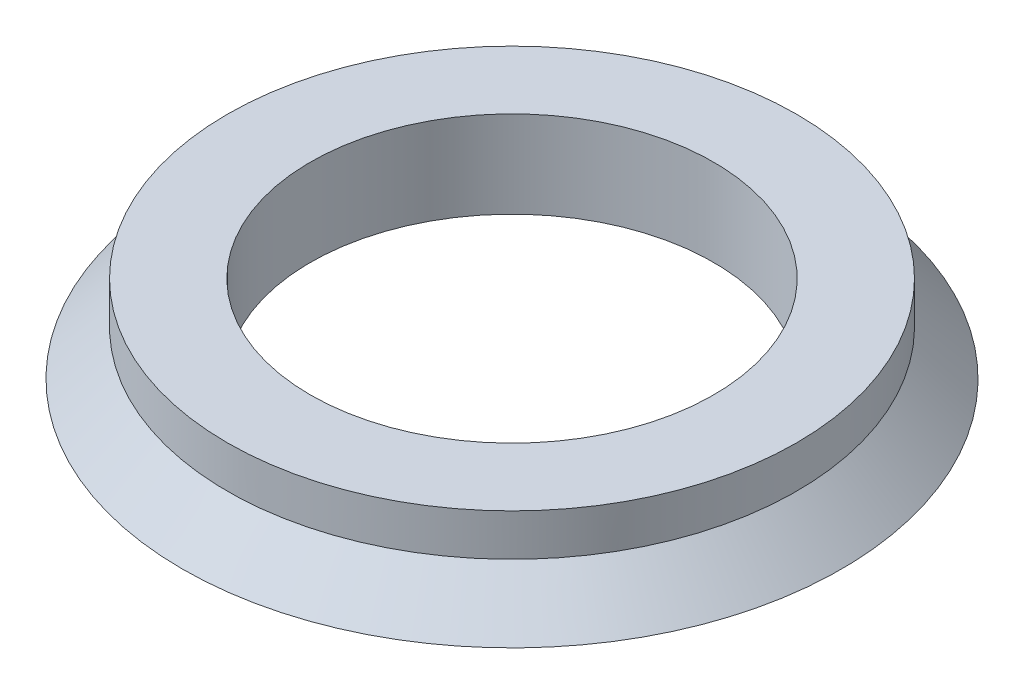
ISO-10303-21;
HEADER;
FILE_DESCRIPTION(('STEP AP214'),'2;1');
FILE_NAME('part.step','',(''),(''),'','','');
FILE_SCHEMA(('AUTOMOTIVE_DESIGN { 1 0 10303 214 1 1 1 1 }'));
ENDSEC;
DATA;
#1=APPLICATION_CONTEXT('core data for automotive mechanical design processes');
#2=APPLICATION_PROTOCOL_DEFINITION('international standard','automotive_design',2000,#1);
#3=PRODUCT_CONTEXT('',#1,'mechanical');
#4=PRODUCT('Part','Part','',(#3));
#5=PRODUCT_RELATED_PRODUCT_CATEGORY('part','',(#4));
#6=PRODUCT_DEFINITION_FORMATION('','',#4);
#7=PRODUCT_DEFINITION_CONTEXT('part definition',#1,'design');
#8=PRODUCT_DEFINITION('design','',#6,#7);
#9=PRODUCT_DEFINITION_SHAPE('','',#8);
#10=(LENGTH_UNIT() NAMED_UNIT(*) SI_UNIT(.MILLI.,.METRE.));
#11=(NAMED_UNIT(*) PLANE_ANGLE_UNIT() SI_UNIT($,.RADIAN.));
#12=(NAMED_UNIT(*) SI_UNIT($,.STERADIAN.) SOLID_ANGLE_UNIT());
#13=UNCERTAINTY_MEASURE_WITH_UNIT(LENGTH_MEASURE(1.E-05),#10,'distance_accuracy_value','');
#14=(GEOMETRIC_REPRESENTATION_CONTEXT(3) GLOBAL_UNCERTAINTY_ASSIGNED_CONTEXT((#13)) GLOBAL_UNIT_ASSIGNED_CONTEXT((#10,
#11,#12)) REPRESENTATION_CONTEXT('',''));
#15=CARTESIAN_POINT('',(0.,0.,0.));
#16=DIRECTION('',(0.,0.,1.));
#17=DIRECTION('',(1.,0.,0.));
#18=AXIS2_PLACEMENT_3D('',#15,#16,#17);
#19=CARTESIAN_POINT('',(0.,0.,0.));
#20=DIRECTION('',(0.,1.,0.));
#21=DIRECTION('',(0.,0.,1.));
#22=AXIS2_PLACEMENT_3D('',#19,#20,#21);
#23=PLANE('',#22);
#24=CARTESIAN_POINT('',(0.,0.,0.));
#25=DIRECTION('',(0.,1.,0.));
#26=DIRECTION('',(0.,0.,1.));
#27=AXIS2_PLACEMENT_3D('',#24,#25,#26);
#28=CIRCLE('',#27,11.);
#29=CARTESIAN_POINT('',(0.,0.,-11.));
#30=VERTEX_POINT('',#29);
#31=EDGE_CURVE('E40',#30,#30,#28,.T.);
#32=ORIENTED_EDGE('',*,*,#31,.F.);
#33=EDGE_LOOP('',(#32));
#34=FACE_BOUND('',#33,.T.);
#35=CARTESIAN_POINT('',(0.,0.,0.));
#36=DIRECTION('',(0.,1.,0.));
#37=DIRECTION('',(0.,0.,1.));
#38=AXIS2_PLACEMENT_3D('',#35,#36,#37);
#39=CIRCLE('',#38,6.731);
#40=CARTESIAN_POINT('',(0.,0.,6.731));
#41=VERTEX_POINT('',#40);
#42=EDGE_CURVE('E44',#41,#41,#39,.T.);
#43=ORIENTED_EDGE('',*,*,#42,.T.);
#44=EDGE_LOOP('',(#43));
#45=FACE_BOUND('',#44,.T.);
#46=ADVANCED_FACE('F32',(#34,#45),#23,.F.);
#47=CARTESIAN_POINT('',(0.,1.5,0.));
#48=DIRECTION('',(0.,-1.,0.));
#49=DIRECTION('',(0.,0.,-1.));
#50=AXIS2_PLACEMENT_3D('',#47,#48,#49);
#51=CYLINDRICAL_SURFACE('',#50,6.731);
#52=ORIENTED_EDGE('',*,*,#42,.F.);
#53=EDGE_LOOP('',(#52));
#54=FACE_BOUND('',#53,.T.);
#55=CARTESIAN_POINT('',(0.,2.9,0.));
#56=DIRECTION('',(0.,1.,0.));
#57=DIRECTION('',(0.,0.,1.));
#58=AXIS2_PLACEMENT_3D('',#55,#56,#57);
#59=CIRCLE('',#58,6.731);
#60=CARTESIAN_POINT('',(0.,2.9,6.731));
#61=VERTEX_POINT('',#60);
#62=EDGE_CURVE('E53',#61,#61,#59,.T.);
#63=ORIENTED_EDGE('',*,*,#62,.T.);
#64=EDGE_LOOP('',(#63));
#65=FACE_BOUND('',#64,.T.);
#66=ADVANCED_FACE('F57',(#54,#65),#51,.F.);
#67=CARTESIAN_POINT('',(0.,1.5,0.));
#68=DIRECTION('',(0.,-1.,0.));
#69=DIRECTION('',(0.,0.,-1.));
#70=AXIS2_PLACEMENT_3D('',#67,#68,#69);
#71=CONICAL_SURFACE('',#70,9.49999999999999,0.785398163397446);
#72=CARTESIAN_POINT('',(0.,1.5,0.));
#73=DIRECTION('',(0.,1.,0.));
#74=DIRECTION('',(0.,0.,1.));
#75=AXIS2_PLACEMENT_3D('',#72,#73,#74);
#76=CIRCLE('',#75,9.49999999999999);
#77=CARTESIAN_POINT('',(0.,1.5,-9.49999999999999));
#78=VERTEX_POINT('',#77);
#79=EDGE_CURVE('E10',#78,#78,#76,.T.);
#80=CARTESIAN_POINT('',(0.,0.,-11.));
#81=CARTESIAN_POINT('',(0.,0.0156249999999998,-10.984375));
#82=CARTESIAN_POINT('',(0.,0.0312499999999998,-10.96875));
#83=CARTESIAN_POINT('',(0.,0.0624999999999998,-10.9375));
#84=CARTESIAN_POINT('',(0.,0.0781249999999998,-10.921875));
#85=CARTESIAN_POINT('',(0.,0.109375,-10.890625));
#86=CARTESIAN_POINT('',(0.,0.125,-10.875));
#87=CARTESIAN_POINT('',(0.,0.15625,-10.84375));
#88=CARTESIAN_POINT('',(0.,0.171875,-10.828125));
#89=CARTESIAN_POINT('',(0.,0.203125,-10.796875));
#90=CARTESIAN_POINT('',(0.,0.21875,-10.78125));
#91=CARTESIAN_POINT('',(0.,0.25,-10.75));
#92=CARTESIAN_POINT('',(0.,0.265625,-10.734375));
#93=CARTESIAN_POINT('',(0.,0.296875,-10.703125));
#94=CARTESIAN_POINT('',(0.,0.3125,-10.6875));
#95=CARTESIAN_POINT('',(0.,0.34375,-10.65625));
#96=CARTESIAN_POINT('',(0.,0.359375,-10.640625));
#97=CARTESIAN_POINT('',(0.,0.390625,-10.609375));
#98=CARTESIAN_POINT('',(0.,0.40625,-10.59375));
#99=CARTESIAN_POINT('',(0.,0.4375,-10.5625));
#100=CARTESIAN_POINT('',(0.,0.453125,-10.546875));
#101=CARTESIAN_POINT('',(0.,0.484375,-10.515625));
#102=CARTESIAN_POINT('',(0.,0.5,-10.5));
#103=CARTESIAN_POINT('',(0.,0.53125,-10.46875));
#104=CARTESIAN_POINT('',(0.,0.546875,-10.453125));
#105=CARTESIAN_POINT('',(0.,0.578125,-10.421875));
#106=CARTESIAN_POINT('',(0.,0.59375,-10.40625));
#107=CARTESIAN_POINT('',(0.,0.625,-10.375));
#108=CARTESIAN_POINT('',(0.,0.640625,-10.359375));
#109=CARTESIAN_POINT('',(0.,0.671875,-10.328125));
#110=CARTESIAN_POINT('',(0.,0.6875,-10.3125));
#111=CARTESIAN_POINT('',(0.,0.71875,-10.28125));
#112=CARTESIAN_POINT('',(0.,0.734375,-10.265625));
#113=CARTESIAN_POINT('',(0.,0.765625,-10.234375));
#114=CARTESIAN_POINT('',(0.,0.78125,-10.21875));
#115=CARTESIAN_POINT('',(0.,0.8125,-10.1875));
#116=CARTESIAN_POINT('',(0.,0.828125,-10.171875));
#117=CARTESIAN_POINT('',(0.,0.859375,-10.140625));
#118=CARTESIAN_POINT('',(0.,0.875,-10.125));
#119=CARTESIAN_POINT('',(0.,0.90625,-10.09375));
#120=CARTESIAN_POINT('',(0.,0.921875,-10.078125));
#121=CARTESIAN_POINT('',(0.,0.953125,-10.046875));
#122=CARTESIAN_POINT('',(0.,0.96875,-10.03125));
#123=CARTESIAN_POINT('',(0.,1.,-9.99999999999999));
#124=CARTESIAN_POINT('',(0.,1.015625,-9.98437499999999));
#125=CARTESIAN_POINT('',(0.,1.046875,-9.95312499999999));
#126=CARTESIAN_POINT('',(0.,1.0625,-9.93749999999999));
#127=CARTESIAN_POINT('',(0.,1.09375,-9.90624999999999));
#128=CARTESIAN_POINT('',(0.,1.109375,-9.89062499999999));
#129=CARTESIAN_POINT('',(0.,1.140625,-9.85937499999999));
#130=CARTESIAN_POINT('',(0.,1.15625,-9.84374999999999));
#131=CARTESIAN_POINT('',(0.,1.1875,-9.81249999999999));
#132=CARTESIAN_POINT('',(0.,1.203125,-9.79687499999999));
#133=CARTESIAN_POINT('',(0.,1.234375,-9.76562499999999));
#134=CARTESIAN_POINT('',(0.,1.25,-9.74999999999999));
#135=CARTESIAN_POINT('',(0.,1.28125,-9.71874999999999));
#136=CARTESIAN_POINT('',(0.,1.296875,-9.70312499999999));
#137=CARTESIAN_POINT('',(0.,1.328125,-9.67187499999999));
#138=CARTESIAN_POINT('',(0.,1.34375,-9.65624999999999));
#139=CARTESIAN_POINT('',(0.,1.375,-9.62499999999999));
#140=CARTESIAN_POINT('',(0.,1.390625,-9.60937499999999));
#141=CARTESIAN_POINT('',(0.,1.421875,-9.57812499999999));
#142=CARTESIAN_POINT('',(0.,1.4375,-9.56249999999999));
#143=CARTESIAN_POINT('',(0.,1.46875,-9.53124999999999));
#144=CARTESIAN_POINT('',(0.,1.484375,-9.51562499999999));
#145=CARTESIAN_POINT('',(0.,1.5,-9.49999999999999));
#146=B_SPLINE_CURVE_WITH_KNOTS('',3,(#80,#81,#82,#83,#84,#85,#86,#87,#88,#89,#90,#91,#92,#93,
#94,#95,#96,#97,#98,#99,#100,#101,#102,#103,#104,#105,#106,#107,#108,#109,#110,#111,#112,#113,
#114,#115,#116,#117,#118,#119,#120,#121,#122,#123,#124,#125,#126,#127,#128,#129,#130,#131,#132,
#133,#134,#135,#136,#137,#138,#139,#140,#141,#142,#143,#144,#145),.UNSPECIFIED.,.F.,.F.,(4,2,2,
2,2,2,2,2,2,2,2,2,2,2,2,2,2,2,2,2,2,2,2,2,2,2,2,2,2,2,2,2,4),(0.,0.0662912607362389,
0.132582521472478,0.198873782208717,0.265165042944955,0.331456303681194,0.397747564417433,
0.464038825153671,0.53033008588991,0.596621346626148,0.662912607362387,0.729203868098626,
0.795495128834865,0.861786389571104,0.928077650307342,0.99436891104358,1.06066017177982,
1.12695143251606,1.1932426932523,1.25953395398854,1.32582521472477,1.39211647546101,
1.45840773619725,1.52469899693349,1.59099025766973,1.65728151840597,1.72357277914221,
1.78986403987845,1.85615530061468,1.92244656135092,1.98873782208716,2.0550290828234,
2.12132034355964),.UNSPECIFIED.);
#147=EDGE_CURVE('BSEAM35',#30,#78,#146,.T.);
#148=ORIENTED_EDGE('',*,*,#31,.T.);
#149=ORIENTED_EDGE('',*,*,#79,.F.);
#150=ORIENTED_EDGE('',*,*,#147,.T.);
#151=ORIENTED_EDGE('',*,*,#147,.F.);
#152=EDGE_LOOP('',(#148,#150,#149,#151));
#153=FACE_BOUND('',#152,.T.);
#154=ADVANCED_FACE('F35',(#153),#71,.T.);
#155=CARTESIAN_POINT('',(0.,2.9,0.));
#156=DIRECTION('',(0.,1.,0.));
#157=DIRECTION('',(0.,0.,1.));
#158=AXIS2_PLACEMENT_3D('',#155,#156,#157);
#159=PLANE('',#158);
#160=CARTESIAN_POINT('',(0.,2.9,0.));
#161=DIRECTION('',(0.,1.,0.));
#162=DIRECTION('',(0.,0.,1.));
#163=AXIS2_PLACEMENT_3D('',#160,#161,#162);
#164=CIRCLE('',#163,9.49999999999999);
#165=CARTESIAN_POINT('',(0.,2.9,9.49999999999999));
#166=VERTEX_POINT('',#165);
#167=EDGE_CURVE('E48',#166,#166,#164,.T.);
#168=ORIENTED_EDGE('',*,*,#167,.T.);
#169=EDGE_LOOP('',(#168));
#170=FACE_BOUND('',#169,.T.);
#171=ORIENTED_EDGE('',*,*,#62,.F.);
#172=EDGE_LOOP('',(#171));
#173=FACE_BOUND('',#172,.T.);
#174=ADVANCED_FACE('F59',(#170,#173),#159,.T.);
#175=CARTESIAN_POINT('',(0.,2.9,0.));
#176=DIRECTION('',(0.,-1.,0.));
#177=DIRECTION('',(0.,0.,-1.));
#178=AXIS2_PLACEMENT_3D('',#175,#176,#177);
#179=CYLINDRICAL_SURFACE('',#178,9.49999999999999);
#180=ORIENTED_EDGE('',*,*,#167,.F.);
#181=EDGE_LOOP('',(#180));
#182=FACE_BOUND('',#181,.T.);
#183=ORIENTED_EDGE('',*,*,#79,.T.);
#184=EDGE_LOOP('',(#183));
#185=FACE_BOUND('',#184,.T.);
#186=ADVANCED_FACE('F61',(#182,#185),#179,.T.);
#187=CLOSED_SHELL('',(#46,#66,#154,#174,#186));
#188=MANIFOLD_SOLID_BREP('B2',#187);
#189=ADVANCED_BREP_SHAPE_REPRESENTATION('',(#18,#188),#14);
#190=SHAPE_DEFINITION_REPRESENTATION(#9,#189);
ENDSEC;
END-ISO-10303-21;
